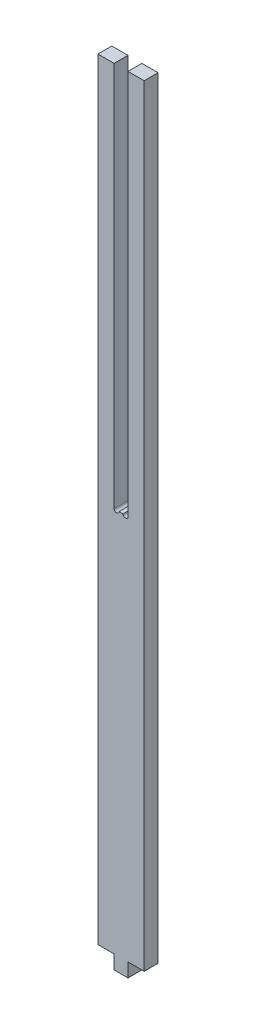
ISO-10303-21;
HEADER;
FILE_DESCRIPTION(('STEP AP214'),'2;1');
FILE_NAME('part.step','',(''),(''),'','','');
FILE_SCHEMA(('AUTOMOTIVE_DESIGN { 1 0 10303 214 1 1 1 1 }'));
ENDSEC;
DATA;
#1=APPLICATION_CONTEXT('core data for automotive mechanical design processes');
#2=APPLICATION_PROTOCOL_DEFINITION('international standard','automotive_design',2000,#1);
#3=PRODUCT_CONTEXT('',#1,'mechanical');
#4=PRODUCT('Part','Part','',(#3));
#5=PRODUCT_RELATED_PRODUCT_CATEGORY('part','',(#4));
#6=PRODUCT_DEFINITION_FORMATION('','',#4);
#7=PRODUCT_DEFINITION_CONTEXT('part definition',#1,'design');
#8=PRODUCT_DEFINITION('design','',#6,#7);
#9=PRODUCT_DEFINITION_SHAPE('','',#8);
#10=(LENGTH_UNIT() NAMED_UNIT(*) SI_UNIT(.MILLI.,.METRE.));
#11=(NAMED_UNIT(*) PLANE_ANGLE_UNIT() SI_UNIT($,.RADIAN.));
#12=(NAMED_UNIT(*) SI_UNIT($,.STERADIAN.) SOLID_ANGLE_UNIT());
#13=UNCERTAINTY_MEASURE_WITH_UNIT(LENGTH_MEASURE(1.E-05),#10,'distance_accuracy_value','');
#14=(GEOMETRIC_REPRESENTATION_CONTEXT(3) GLOBAL_UNCERTAINTY_ASSIGNED_CONTEXT((#13)) GLOBAL_UNIT_ASSIGNED_CONTEXT((#10,
#11,#12)) REPRESENTATION_CONTEXT('',''));
#15=CARTESIAN_POINT('',(0.,0.,0.));
#16=DIRECTION('',(0.,0.,1.));
#17=DIRECTION('',(1.,0.,0.));
#18=AXIS2_PLACEMENT_3D('',#15,#16,#17);
#19=CARTESIAN_POINT('',(-33.2222222222223,825.,18.));
#20=DIRECTION('',(0.,1.,0.));
#21=DIRECTION('',(0.,0.,1.));
#22=AXIS2_PLACEMENT_3D('',#19,#20,#21);
#23=PLANE('',#22);
#24=DIRECTION('',(1.,0.,0.));
#25=VECTOR('',#24,1.);
#26=CARTESIAN_POINT('',(-33.2222222222223,825.,0.));
#27=LINE('',#26,#25);
#28=CARTESIAN_POINT('',(-33.2222222222223,825.,0.));
#29=VERTEX_POINT('',#28);
#30=CARTESIAN_POINT('',(-12.2222222222223,825.,0.));
#31=VERTEX_POINT('',#30);
#32=EDGE_CURVE('E166',#29,#31,#27,.T.);
#33=ORIENTED_EDGE('',*,*,#32,.F.);
#34=DIRECTION('',(0.,0.,-1.));
#35=VECTOR('',#34,1.);
#36=CARTESIAN_POINT('',(-33.2222222222223,825.,18.));
#37=LINE('',#36,#35);
#38=CARTESIAN_POINT('',(-33.2222222222223,825.,18.));
#39=VERTEX_POINT('',#38);
#40=EDGE_CURVE('E11',#39,#29,#37,.T.);
#41=ORIENTED_EDGE('',*,*,#40,.F.);
#42=DIRECTION('',(1.,0.,0.));
#43=VECTOR('',#42,1.);
#44=CARTESIAN_POINT('',(-33.2222222222223,825.,18.));
#45=LINE('',#44,#43);
#46=CARTESIAN_POINT('',(-12.2222222222223,825.,18.));
#47=VERTEX_POINT('',#46);
#48=EDGE_CURVE('E201',#39,#47,#45,.T.);
#49=ORIENTED_EDGE('',*,*,#48,.T.);
#50=DIRECTION('',(0.,0.,-1.));
#51=VECTOR('',#50,1.);
#52=CARTESIAN_POINT('',(-12.2222222222223,825.,18.));
#53=LINE('',#52,#51);
#54=EDGE_CURVE('E36',#47,#31,#53,.T.);
#55=ORIENTED_EDGE('',*,*,#54,.T.);
#56=EDGE_LOOP('',(#33,#41,#49,#55));
#57=FACE_BOUND('',#56,.T.);
#58=ADVANCED_FACE('F33',(#57),#23,.T.);
#59=CARTESIAN_POINT('',(-33.2222222222223,325.,18.));
#60=DIRECTION('',(-1.,0.,0.));
#61=DIRECTION('',(0.,0.,1.));
#62=AXIS2_PLACEMENT_3D('',#59,#60,#61);
#63=PLANE('',#62);
#64=DIRECTION('',(0.,1.,0.));
#65=VECTOR('',#64,1.);
#66=CARTESIAN_POINT('',(-33.2222222222223,325.,0.));
#67=LINE('',#66,#65);
#68=CARTESIAN_POINT('',(-33.2222222222223,325.,0.));
#69=VERTEX_POINT('',#68);
#70=EDGE_CURVE('E199',#69,#29,#67,.T.);
#71=ORIENTED_EDGE('',*,*,#70,.F.);
#72=DIRECTION('',(0.,0.,-1.));
#73=VECTOR('',#72,1.);
#74=CARTESIAN_POINT('',(-33.2222222222223,325.,18.));
#75=LINE('',#74,#73);
#76=CARTESIAN_POINT('',(-33.2222222222223,325.,18.));
#77=VERTEX_POINT('',#76);
#78=EDGE_CURVE('E42',#77,#69,#75,.T.);
#79=ORIENTED_EDGE('',*,*,#78,.F.);
#80=DIRECTION('',(0.,1.,0.));
#81=VECTOR('',#80,1.);
#82=CARTESIAN_POINT('',(-33.2222222222223,325.,18.));
#83=LINE('',#82,#81);
#84=EDGE_CURVE('E148',#77,#39,#83,.T.);
#85=ORIENTED_EDGE('',*,*,#84,.T.);
#86=ORIENTED_EDGE('',*,*,#40,.T.);
#87=EDGE_LOOP('',(#71,#79,#85,#86));
#88=FACE_BOUND('',#87,.T.);
#89=ADVANCED_FACE('F229',(#88),#63,.T.);
#90=CARTESIAN_POINT('',(-36.3972222222223,325.,18.));
#91=DIRECTION('',(0.,0.,-1.));
#92=DIRECTION('',(-1.,0.,0.));
#93=AXIS2_PLACEMENT_3D('',#90,#91,#92);
#94=CYLINDRICAL_SURFACE('',#93,3.175);
#95=CARTESIAN_POINT('',(-36.3972222222223,325.,0.));
#96=DIRECTION('',(0.,0.,-1.));
#97=DIRECTION('',(-1.,0.,0.));
#98=AXIS2_PLACEMENT_3D('',#95,#96,#97);
#99=CIRCLE('',#98,3.175);
#100=CARTESIAN_POINT('',(-39.5722222222223,325.,0.));
#101=VERTEX_POINT('',#100);
#102=EDGE_CURVE('E152',#69,#101,#99,.T.);
#103=ORIENTED_EDGE('',*,*,#102,.T.);
#104=DIRECTION('',(0.,0.,-1.));
#105=VECTOR('',#104,1.);
#106=CARTESIAN_POINT('',(-39.5722222222223,325.,18.));
#107=LINE('',#106,#105);
#108=CARTESIAN_POINT('',(-39.5722222222223,325.,18.));
#109=VERTEX_POINT('',#108);
#110=EDGE_CURVE('E150',#109,#101,#107,.T.);
#111=ORIENTED_EDGE('',*,*,#110,.F.);
#112=CARTESIAN_POINT('',(-36.3972222222223,325.,18.));
#113=DIRECTION('',(0.,0.,-1.));
#114=DIRECTION('',(-1.,0.,0.));
#115=AXIS2_PLACEMENT_3D('',#112,#113,#114);
#116=CIRCLE('',#115,3.175);
#117=EDGE_CURVE('E141',#77,#109,#116,.T.);
#118=ORIENTED_EDGE('',*,*,#117,.F.);
#119=ORIENTED_EDGE('',*,*,#78,.T.);
#120=EDGE_LOOP('',(#103,#111,#118,#119));
#121=FACE_BOUND('',#120,.T.);
#122=ADVANCED_FACE('F151',(#121),#94,.F.);
#123=CARTESIAN_POINT('',(-44.8722222222223,325.,18.));
#124=DIRECTION('',(0.,1.,0.));
#125=DIRECTION('',(0.,0.,1.));
#126=AXIS2_PLACEMENT_3D('',#123,#124,#125);
#127=PLANE('',#126);
#128=DIRECTION('',(1.,0.,0.));
#129=VECTOR('',#128,1.);
#130=CARTESIAN_POINT('',(-44.8722222222223,325.,0.));
#131=LINE('',#130,#129);
#132=CARTESIAN_POINT('',(-44.8722222222223,325.,0.));
#133=VERTEX_POINT('',#132);
#134=EDGE_CURVE('E196',#133,#101,#131,.T.);
#135=ORIENTED_EDGE('',*,*,#134,.F.);
#136=DIRECTION('',(0.,0.,-1.));
#137=VECTOR('',#136,1.);
#138=CARTESIAN_POINT('',(-44.8722222222223,325.,18.));
#139=LINE('',#138,#137);
#140=CARTESIAN_POINT('',(-44.8722222222223,325.,18.));
#141=VERTEX_POINT('',#140);
#142=EDGE_CURVE('E156',#141,#133,#139,.T.);
#143=ORIENTED_EDGE('',*,*,#142,.F.);
#144=DIRECTION('',(1.,0.,0.));
#145=VECTOR('',#144,1.);
#146=CARTESIAN_POINT('',(-44.8722222222223,325.,18.));
#147=LINE('',#146,#145);
#148=EDGE_CURVE('E146',#141,#109,#147,.T.);
#149=ORIENTED_EDGE('',*,*,#148,.T.);
#150=ORIENTED_EDGE('',*,*,#110,.T.);
#151=EDGE_LOOP('',(#135,#143,#149,#150));
#152=FACE_BOUND('',#151,.T.);
#153=ADVANCED_FACE('F158',(#152),#127,.T.);
#154=CARTESIAN_POINT('',(-48.0472222222223,325.,18.));
#155=DIRECTION('',(0.,0.,-1.));
#156=DIRECTION('',(-1.,0.,0.));
#157=AXIS2_PLACEMENT_3D('',#154,#155,#156);
#158=CYLINDRICAL_SURFACE('',#157,3.175);
#159=CARTESIAN_POINT('',(-48.0472222222223,325.,0.));
#160=DIRECTION('',(0.,0.,1.));
#161=DIRECTION('',(1.,0.,0.));
#162=AXIS2_PLACEMENT_3D('',#159,#160,#161);
#163=CIRCLE('',#162,3.175);
#164=CARTESIAN_POINT('',(-51.2222222222223,325.,0.));
#165=VERTEX_POINT('',#164);
#166=EDGE_CURVE('E193',#165,#133,#163,.T.);
#167=ORIENTED_EDGE('',*,*,#166,.F.);
#168=DIRECTION('',(0.,0.,-1.));
#169=VECTOR('',#168,1.);
#170=CARTESIAN_POINT('',(-51.2222222222223,325.,18.));
#171=LINE('',#170,#169);
#172=CARTESIAN_POINT('',(-51.2222222222223,325.,18.));
#173=VERTEX_POINT('',#172);
#174=EDGE_CURVE('E205',#173,#165,#171,.T.);
#175=ORIENTED_EDGE('',*,*,#174,.F.);
#176=CARTESIAN_POINT('',(-48.0472222222223,325.,18.));
#177=DIRECTION('',(0.,0.,1.));
#178=DIRECTION('',(1.,0.,0.));
#179=AXIS2_PLACEMENT_3D('',#176,#177,#178);
#180=CIRCLE('',#179,3.175);
#181=EDGE_CURVE('E159',#173,#141,#180,.T.);
#182=ORIENTED_EDGE('',*,*,#181,.T.);
#183=ORIENTED_EDGE('',*,*,#142,.T.);
#184=EDGE_LOOP('',(#167,#175,#182,#183));
#185=FACE_BOUND('',#184,.T.);
#186=ADVANCED_FACE('F242',(#185),#158,.F.);
#187=CARTESIAN_POINT('',(-51.2222222222223,825.,18.));
#188=DIRECTION('',(1.,0.,0.));
#189=DIRECTION('',(0.,1.,0.));
#190=AXIS2_PLACEMENT_3D('',#187,#188,#189);
#191=PLANE('',#190);
#192=DIRECTION('',(0.,-1.,0.));
#193=VECTOR('',#192,1.);
#194=CARTESIAN_POINT('',(-51.2222222222223,825.,0.));
#195=LINE('',#194,#193);
#196=CARTESIAN_POINT('',(-51.2222222222223,825.,0.));
#197=VERTEX_POINT('',#196);
#198=EDGE_CURVE('E190',#197,#165,#195,.T.);
#199=ORIENTED_EDGE('',*,*,#198,.F.);
#200=DIRECTION('',(0.,0.,-1.));
#201=VECTOR('',#200,1.);
#202=CARTESIAN_POINT('',(-51.2222222222223,825.,18.));
#203=LINE('',#202,#201);
#204=CARTESIAN_POINT('',(-51.2222222222223,825.,18.));
#205=VERTEX_POINT('',#204);
#206=EDGE_CURVE('E207',#205,#197,#203,.T.);
#207=ORIENTED_EDGE('',*,*,#206,.F.);
#208=DIRECTION('',(0.,-1.,0.));
#209=VECTOR('',#208,1.);
#210=CARTESIAN_POINT('',(-51.2222222222223,825.,18.));
#211=LINE('',#210,#209);
#212=EDGE_CURVE('E161',#205,#173,#211,.T.);
#213=ORIENTED_EDGE('',*,*,#212,.T.);
#214=ORIENTED_EDGE('',*,*,#174,.T.);
#215=EDGE_LOOP('',(#199,#207,#213,#214));
#216=FACE_BOUND('',#215,.T.);
#217=ADVANCED_FACE('F245',(#216),#191,.T.);
#218=CARTESIAN_POINT('',(-72.2222222222223,825.,18.));
#219=DIRECTION('',(0.,1.,0.));
#220=DIRECTION('',(0.,0.,1.));
#221=AXIS2_PLACEMENT_3D('',#218,#219,#220);
#222=PLANE('',#221);
#223=DIRECTION('',(1.,0.,0.));
#224=VECTOR('',#223,1.);
#225=CARTESIAN_POINT('',(-72.2222222222223,825.,0.));
#226=LINE('',#225,#224);
#227=CARTESIAN_POINT('',(-72.2222222222223,825.,0.));
#228=VERTEX_POINT('',#227);
#229=EDGE_CURVE('E187',#228,#197,#226,.T.);
#230=ORIENTED_EDGE('',*,*,#229,.F.);
#231=DIRECTION('',(0.,0.,-1.));
#232=VECTOR('',#231,1.);
#233=CARTESIAN_POINT('',(-72.2222222222223,825.,18.));
#234=LINE('',#233,#232);
#235=CARTESIAN_POINT('',(-72.2222222222223,825.,18.));
#236=VERTEX_POINT('',#235);
#237=EDGE_CURVE('E209',#236,#228,#234,.T.);
#238=ORIENTED_EDGE('',*,*,#237,.F.);
#239=DIRECTION('',(1.,0.,0.));
#240=VECTOR('',#239,1.);
#241=CARTESIAN_POINT('',(-72.2222222222223,825.,18.));
#242=LINE('',#241,#240);
#243=EDGE_CURVE('E398',#236,#205,#242,.T.);
#244=ORIENTED_EDGE('',*,*,#243,.T.);
#245=ORIENTED_EDGE('',*,*,#206,.T.);
#246=EDGE_LOOP('',(#230,#238,#244,#245));
#247=FACE_BOUND('',#246,.T.);
#248=ADVANCED_FACE('F249',(#247),#222,.T.);
#249=CARTESIAN_POINT('',(-72.2222222222223,825.,18.));
#250=DIRECTION('',(1.,0.,0.));
#251=DIRECTION('',(0.,1.,0.));
#252=AXIS2_PLACEMENT_3D('',#249,#250,#251);
#253=PLANE('',#252);
#254=DIRECTION('',(0.,-1.,0.));
#255=VECTOR('',#254,1.);
#256=CARTESIAN_POINT('',(-72.2222222222223,825.,0.));
#257=LINE('',#256,#255);
#258=CARTESIAN_POINT('',(-72.2222222222222,-175.,0.));
#259=VERTEX_POINT('',#258);
#260=EDGE_CURVE('E185',#228,#259,#257,.T.);
#261=ORIENTED_EDGE('',*,*,#260,.T.);
#262=DIRECTION('',(0.,0.,-1.));
#263=VECTOR('',#262,1.);
#264=CARTESIAN_POINT('',(-72.2222222222222,-175.,18.));
#265=LINE('',#264,#263);
#266=CARTESIAN_POINT('',(-72.2222222222222,-175.,18.));
#267=VERTEX_POINT('',#266);
#268=EDGE_CURVE('E211',#267,#259,#265,.T.);
#269=ORIENTED_EDGE('',*,*,#268,.F.);
#270=DIRECTION('',(0.,-1.,0.));
#271=VECTOR('',#270,1.);
#272=CARTESIAN_POINT('',(-72.2222222222223,825.,18.));
#273=LINE('',#272,#271);
#274=EDGE_CURVE('E393',#236,#267,#273,.T.);
#275=ORIENTED_EDGE('',*,*,#274,.F.);
#276=ORIENTED_EDGE('',*,*,#237,.T.);
#277=EDGE_LOOP('',(#261,#269,#275,#276));
#278=FACE_BOUND('',#277,.T.);
#279=ADVANCED_FACE('F253',(#278),#253,.F.);
#280=CARTESIAN_POINT('',(-72.2222222222222,-175.,18.));
#281=DIRECTION('',(0.,1.,0.));
#282=DIRECTION('',(0.,0.,1.));
#283=AXIS2_PLACEMENT_3D('',#280,#281,#282);
#284=PLANE('',#283);
#285=DIRECTION('',(1.,0.,0.));
#286=VECTOR('',#285,1.);
#287=CARTESIAN_POINT('',(-72.2222222222222,-175.,0.));
#288=LINE('',#287,#286);
#289=CARTESIAN_POINT('',(-51.2222222222223,-175.,0.));
#290=VERTEX_POINT('',#289);
#291=EDGE_CURVE('E183',#259,#290,#288,.T.);
#292=ORIENTED_EDGE('',*,*,#291,.T.);
#293=DIRECTION('',(0.,0.,-1.));
#294=VECTOR('',#293,1.);
#295=CARTESIAN_POINT('',(-51.2222222222223,-175.,18.));
#296=LINE('',#295,#294);
#297=CARTESIAN_POINT('',(-51.2222222222223,-175.,18.));
#298=VERTEX_POINT('',#297);
#299=EDGE_CURVE('E214',#298,#290,#296,.T.);
#300=ORIENTED_EDGE('',*,*,#299,.F.);
#301=DIRECTION('',(1.,0.,0.));
#302=VECTOR('',#301,1.);
#303=CARTESIAN_POINT('',(-72.2222222222222,-175.,18.));
#304=LINE('',#303,#302);
#305=EDGE_CURVE('E390',#267,#298,#304,.T.);
#306=ORIENTED_EDGE('',*,*,#305,.F.);
#307=ORIENTED_EDGE('',*,*,#268,.T.);
#308=EDGE_LOOP('',(#292,#300,#306,#307));
#309=FACE_BOUND('',#308,.T.);
#310=ADVANCED_FACE('F257',(#309),#284,.F.);
#311=CARTESIAN_POINT('',(-51.2222222222223,-175.,18.));
#312=DIRECTION('',(1.,0.,0.));
#313=DIRECTION('',(0.,0.,-1.));
#314=AXIS2_PLACEMENT_3D('',#311,#312,#313);
#315=PLANE('',#314);
#316=DIRECTION('',(0.,-1.,0.));
#317=VECTOR('',#316,1.);
#318=CARTESIAN_POINT('',(-51.2222222222223,-175.,0.));
#319=LINE('',#318,#317);
#320=CARTESIAN_POINT('',(-51.2222222222223,-193.,0.));
#321=VERTEX_POINT('',#320);
#322=EDGE_CURVE('E181',#290,#321,#319,.T.);
#323=ORIENTED_EDGE('',*,*,#322,.T.);
#324=DIRECTION('',(0.,0.,-1.));
#325=VECTOR('',#324,1.);
#326=CARTESIAN_POINT('',(-51.2222222222223,-193.,18.));
#327=LINE('',#326,#325);
#328=CARTESIAN_POINT('',(-51.2222222222223,-193.,18.));
#329=VERTEX_POINT('',#328);
#330=EDGE_CURVE('E217',#329,#321,#327,.T.);
#331=ORIENTED_EDGE('',*,*,#330,.F.);
#332=DIRECTION('',(0.,-1.,0.));
#333=VECTOR('',#332,1.);
#334=CARTESIAN_POINT('',(-51.2222222222223,-175.,18.));
#335=LINE('',#334,#333);
#336=EDGE_CURVE('E388',#298,#329,#335,.T.);
#337=ORIENTED_EDGE('',*,*,#336,.F.);
#338=ORIENTED_EDGE('',*,*,#299,.T.);
#339=EDGE_LOOP('',(#323,#331,#337,#338));
#340=FACE_BOUND('',#339,.T.);
#341=ADVANCED_FACE('F261',(#340),#315,.F.);
#342=CARTESIAN_POINT('',(-51.2222222222223,-193.,18.));
#343=DIRECTION('',(0.,1.,0.));
#344=DIRECTION('',(0.,0.,1.));
#345=AXIS2_PLACEMENT_3D('',#342,#343,#344);
#346=PLANE('',#345);
#347=DIRECTION('',(1.,0.,0.));
#348=VECTOR('',#347,1.);
#349=CARTESIAN_POINT('',(-51.2222222222223,-193.,0.));
#350=LINE('',#349,#348);
#351=CARTESIAN_POINT('',(-33.2222222222224,-193.,0.));
#352=VERTEX_POINT('',#351);
#353=EDGE_CURVE('E178',#321,#352,#350,.T.);
#354=ORIENTED_EDGE('',*,*,#353,.T.);
#355=DIRECTION('',(0.,0.,-1.));
#356=VECTOR('',#355,1.);
#357=CARTESIAN_POINT('',(-33.2222222222224,-193.,18.));
#358=LINE('',#357,#356);
#359=CARTESIAN_POINT('',(-33.2222222222224,-193.,18.));
#360=VERTEX_POINT('',#359);
#361=EDGE_CURVE('E220',#360,#352,#358,.T.);
#362=ORIENTED_EDGE('',*,*,#361,.F.);
#363=DIRECTION('',(1.,0.,0.));
#364=VECTOR('',#363,1.);
#365=CARTESIAN_POINT('',(-51.2222222222223,-193.,18.));
#366=LINE('',#365,#364);
#367=EDGE_CURVE('E407',#329,#360,#366,.T.);
#368=ORIENTED_EDGE('',*,*,#367,.F.);
#369=ORIENTED_EDGE('',*,*,#330,.T.);
#370=EDGE_LOOP('',(#354,#362,#368,#369));
#371=FACE_BOUND('',#370,.T.);
#372=ADVANCED_FACE('F265',(#371),#346,.F.);
#373=CARTESIAN_POINT('',(-33.2222222222224,-175.,18.));
#374=DIRECTION('',(1.,0.,0.));
#375=DIRECTION('',(0.,1.,0.));
#376=AXIS2_PLACEMENT_3D('',#373,#374,#375);
#377=PLANE('',#376);
#378=DIRECTION('',(0.,-1.,0.));
#379=VECTOR('',#378,1.);
#380=CARTESIAN_POINT('',(-33.2222222222224,-175.,0.));
#381=LINE('',#380,#379);
#382=CARTESIAN_POINT('',(-33.2222222222224,-175.,0.));
#383=VERTEX_POINT('',#382);
#384=EDGE_CURVE('E175',#383,#352,#381,.T.);
#385=ORIENTED_EDGE('',*,*,#384,.F.);
#386=DIRECTION('',(0.,0.,-1.));
#387=VECTOR('',#386,1.);
#388=CARTESIAN_POINT('',(-33.2222222222224,-175.,18.));
#389=LINE('',#388,#387);
#390=CARTESIAN_POINT('',(-33.2222222222224,-175.,18.));
#391=VERTEX_POINT('',#390);
#392=EDGE_CURVE('E222',#391,#383,#389,.T.);
#393=ORIENTED_EDGE('',*,*,#392,.F.);
#394=DIRECTION('',(0.,-1.,0.));
#395=VECTOR('',#394,1.);
#396=CARTESIAN_POINT('',(-33.2222222222224,-175.,18.));
#397=LINE('',#396,#395);
#398=EDGE_CURVE('E380',#391,#360,#397,.T.);
#399=ORIENTED_EDGE('',*,*,#398,.T.);
#400=ORIENTED_EDGE('',*,*,#361,.T.);
#401=EDGE_LOOP('',(#385,#393,#399,#400));
#402=FACE_BOUND('',#401,.T.);
#403=ADVANCED_FACE('F269',(#402),#377,.T.);
#404=CARTESIAN_POINT('',(-33.2222222222224,-175.,18.));
#405=DIRECTION('',(0.,1.,0.));
#406=DIRECTION('',(0.,0.,1.));
#407=AXIS2_PLACEMENT_3D('',#404,#405,#406);
#408=PLANE('',#407);
#409=DIRECTION('',(1.,0.,0.));
#410=VECTOR('',#409,1.);
#411=CARTESIAN_POINT('',(-33.2222222222224,-175.,0.));
#412=LINE('',#411,#410);
#413=CARTESIAN_POINT('',(-12.2222222222222,-175.,0.));
#414=VERTEX_POINT('',#413);
#415=EDGE_CURVE('E172',#383,#414,#412,.T.);
#416=ORIENTED_EDGE('',*,*,#415,.T.);
#417=DIRECTION('',(0.,0.,-1.));
#418=VECTOR('',#417,1.);
#419=CARTESIAN_POINT('',(-12.2222222222222,-175.,18.));
#420=LINE('',#419,#418);
#421=CARTESIAN_POINT('',(-12.2222222222222,-175.,18.));
#422=VERTEX_POINT('',#421);
#423=EDGE_CURVE('E223',#422,#414,#420,.T.);
#424=ORIENTED_EDGE('',*,*,#423,.F.);
#425=DIRECTION('',(1.,0.,0.));
#426=VECTOR('',#425,1.);
#427=CARTESIAN_POINT('',(-33.2222222222224,-175.,18.));
#428=LINE('',#427,#426);
#429=EDGE_CURVE('E410',#391,#422,#428,.T.);
#430=ORIENTED_EDGE('',*,*,#429,.F.);
#431=ORIENTED_EDGE('',*,*,#392,.T.);
#432=EDGE_LOOP('',(#416,#424,#430,#431));
#433=FACE_BOUND('',#432,.T.);
#434=ADVANCED_FACE('F273',(#433),#408,.F.);
#435=CARTESIAN_POINT('',(-12.2222222222223,825.,18.));
#436=DIRECTION('',(1.,0.,0.));
#437=DIRECTION('',(0.,1.,0.));
#438=AXIS2_PLACEMENT_3D('',#435,#436,#437);
#439=PLANE('',#438);
#440=DIRECTION('',(0.,-1.,0.));
#441=VECTOR('',#440,1.);
#442=CARTESIAN_POINT('',(-12.2222222222223,825.,0.));
#443=LINE('',#442,#441);
#444=EDGE_CURVE('E169',#31,#414,#443,.T.);
#445=ORIENTED_EDGE('',*,*,#444,.F.);
#446=ORIENTED_EDGE('',*,*,#54,.F.);
#447=DIRECTION('',(0.,-1.,0.));
#448=VECTOR('',#447,1.);
#449=CARTESIAN_POINT('',(-12.2222222222223,825.,18.));
#450=LINE('',#449,#448);
#451=EDGE_CURVE('E412',#47,#422,#450,.T.);
#452=ORIENTED_EDGE('',*,*,#451,.T.);
#453=ORIENTED_EDGE('',*,*,#423,.T.);
#454=EDGE_LOOP('',(#445,#446,#452,#453));
#455=FACE_BOUND('',#454,.T.);
#456=ADVANCED_FACE('F225',(#455),#439,.T.);
#457=CARTESIAN_POINT('',(-48.0472222222223,325.,18.));
#458=DIRECTION('',(0.,0.,1.));
#459=DIRECTION('',(1.,0.,0.));
#460=AXIS2_PLACEMENT_3D('',#457,#458,#459);
#461=PLANE('',#460);
#462=ORIENTED_EDGE('',*,*,#48,.F.);
#463=ORIENTED_EDGE('',*,*,#84,.F.);
#464=ORIENTED_EDGE('',*,*,#117,.T.);
#465=ORIENTED_EDGE('',*,*,#148,.F.);
#466=ORIENTED_EDGE('',*,*,#181,.F.);
#467=ORIENTED_EDGE('',*,*,#212,.F.);
#468=ORIENTED_EDGE('',*,*,#243,.F.);
#469=ORIENTED_EDGE('',*,*,#274,.T.);
#470=ORIENTED_EDGE('',*,*,#305,.T.);
#471=ORIENTED_EDGE('',*,*,#336,.T.);
#472=ORIENTED_EDGE('',*,*,#367,.T.);
#473=ORIENTED_EDGE('',*,*,#398,.F.);
#474=ORIENTED_EDGE('',*,*,#429,.T.);
#475=ORIENTED_EDGE('',*,*,#451,.F.);
#476=EDGE_LOOP('',(#462,#463,#464,#465,#466,#467,#468,#469,#470,#471,#472,#473,#474,#475));
#477=FACE_BOUND('',#476,.T.);
#478=ADVANCED_FACE('F143',(#477),#461,.T.);
#479=CARTESIAN_POINT('',(-48.0472222222223,325.,0.));
#480=DIRECTION('',(0.,0.,1.));
#481=DIRECTION('',(1.,0.,0.));
#482=AXIS2_PLACEMENT_3D('',#479,#480,#481);
#483=PLANE('',#482);
#484=ORIENTED_EDGE('',*,*,#32,.T.);
#485=ORIENTED_EDGE('',*,*,#444,.T.);
#486=ORIENTED_EDGE('',*,*,#415,.F.);
#487=ORIENTED_EDGE('',*,*,#384,.T.);
#488=ORIENTED_EDGE('',*,*,#353,.F.);
#489=ORIENTED_EDGE('',*,*,#322,.F.);
#490=ORIENTED_EDGE('',*,*,#291,.F.);
#491=ORIENTED_EDGE('',*,*,#260,.F.);
#492=ORIENTED_EDGE('',*,*,#229,.T.);
#493=ORIENTED_EDGE('',*,*,#198,.T.);
#494=ORIENTED_EDGE('',*,*,#166,.T.);
#495=ORIENTED_EDGE('',*,*,#134,.T.);
#496=ORIENTED_EDGE('',*,*,#102,.F.);
#497=ORIENTED_EDGE('',*,*,#70,.T.);
#498=EDGE_LOOP('',(#484,#485,#486,#487,#488,#489,#490,#491,#492,#493,#494,#495,#496,#497));
#499=FACE_BOUND('',#498,.T.);
#500=ADVANCED_FACE('F228',(#499),#483,.F.);
#501=CLOSED_SHELL('',(#58,#89,#122,#153,#186,#217,#248,#279,#310,#341,#372,#403,#434,#456,#478,#500));
#502=MANIFOLD_SOLID_BREP('B2',#501);
#503=ADVANCED_BREP_SHAPE_REPRESENTATION('',(#18,#502),#14);
#504=SHAPE_DEFINITION_REPRESENTATION(#9,#503);
ENDSEC;
END-ISO-10303-21;
